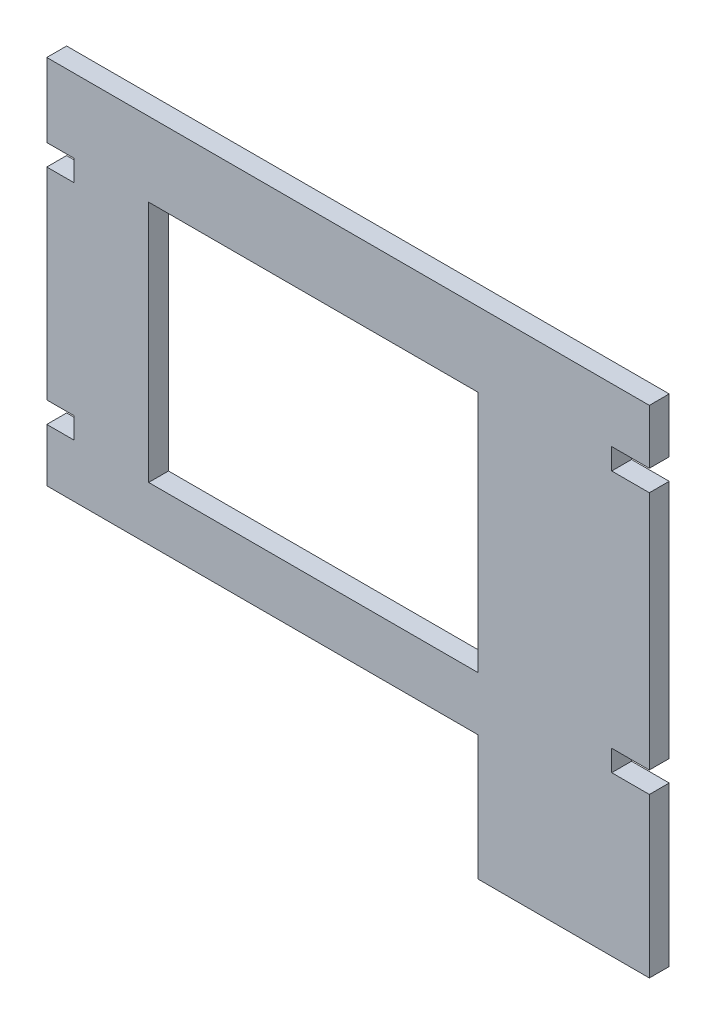
ISO-10303-21;
HEADER;
FILE_DESCRIPTION(('STEP AP214'),'2;1');
FILE_NAME('part.step','',(''),(''),'','','');
FILE_SCHEMA(('AUTOMOTIVE_DESIGN { 1 0 10303 214 1 1 1 1 }'));
ENDSEC;
DATA;
#1=APPLICATION_CONTEXT('core data for automotive mechanical design processes');
#2=APPLICATION_PROTOCOL_DEFINITION('international standard','automotive_design',2000,#1);
#3=PRODUCT_CONTEXT('',#1,'mechanical');
#4=PRODUCT('Part','Part','',(#3));
#5=PRODUCT_RELATED_PRODUCT_CATEGORY('part','',(#4));
#6=PRODUCT_DEFINITION_FORMATION('','',#4);
#7=PRODUCT_DEFINITION_CONTEXT('part definition',#1,'design');
#8=PRODUCT_DEFINITION('design','',#6,#7);
#9=PRODUCT_DEFINITION_SHAPE('','',#8);
#10=(LENGTH_UNIT() NAMED_UNIT(*) SI_UNIT(.MILLI.,.METRE.));
#11=(NAMED_UNIT(*) PLANE_ANGLE_UNIT() SI_UNIT($,.RADIAN.));
#12=(NAMED_UNIT(*) SI_UNIT($,.STERADIAN.) SOLID_ANGLE_UNIT());
#13=UNCERTAINTY_MEASURE_WITH_UNIT(LENGTH_MEASURE(1.E-05),#10,'distance_accuracy_value','');
#14=(GEOMETRIC_REPRESENTATION_CONTEXT(3) GLOBAL_UNCERTAINTY_ASSIGNED_CONTEXT((#13)) GLOBAL_UNIT_ASSIGNED_CONTEXT((#10,
#11,#12)) REPRESENTATION_CONTEXT('',''));
#15=CARTESIAN_POINT('',(0.,0.,0.));
#16=DIRECTION('',(0.,0.,1.));
#17=DIRECTION('',(1.,0.,0.));
#18=AXIS2_PLACEMENT_3D('',#15,#16,#17);
#19=CARTESIAN_POINT('',(81.3,0.,-19.8));
#20=DIRECTION('',(-1.,0.,0.));
#21=DIRECTION('',(0.,0.,1.));
#22=AXIS2_PLACEMENT_3D('',#19,#20,#21);
#23=PLANE('',#22);
#24=DIRECTION('',(0.,-1.,0.));
#25=VECTOR('',#24,1.);
#26=CARTESIAN_POINT('',(81.3,0.,-19.8));
#27=LINE('',#26,#25);
#28=CARTESIAN_POINT('',(81.3,21.5,-19.8));
#29=VERTEX_POINT('',#28);
#30=CARTESIAN_POINT('',(81.3,18.3,-19.8));
#31=VERTEX_POINT('',#30);
#32=EDGE_CURVE('E416',#29,#31,#27,.T.);
#33=ORIENTED_EDGE('',*,*,#32,.F.);
#34=DIRECTION('',(0.,0.,-1.));
#35=VECTOR('',#34,1.);
#36=CARTESIAN_POINT('',(81.3,21.5,24.14));
#37=LINE('',#36,#35);
#38=CARTESIAN_POINT('',(81.3,21.5,-16.8));
#39=VERTEX_POINT('',#38);
#40=EDGE_CURVE('E371',#39,#29,#37,.T.);
#41=ORIENTED_EDGE('',*,*,#40,.F.);
#42=DIRECTION('',(0.,-1.,0.));
#43=VECTOR('',#42,1.);
#44=CARTESIAN_POINT('',(81.3,0.,-16.8));
#45=LINE('',#44,#43);
#46=CARTESIAN_POINT('',(81.3,18.3,-16.8));
#47=VERTEX_POINT('',#46);
#48=EDGE_CURVE('E409',#39,#47,#45,.T.);
#49=ORIENTED_EDGE('',*,*,#48,.T.);
#50=DIRECTION('',(0.,0.,-1.));
#51=VECTOR('',#50,1.);
#52=CARTESIAN_POINT('',(81.3,18.3,24.14));
#53=LINE('',#52,#51);
#54=EDGE_CURVE('E370',#47,#31,#53,.T.);
#55=ORIENTED_EDGE('',*,*,#54,.T.);
#56=EDGE_LOOP('',(#33,#41,#49,#55));
#57=FACE_BOUND('',#56,.T.);
#58=ADVANCED_FACE('F32',(#57),#23,.F.);
#59=CARTESIAN_POINT('',(81.3,61.,-16.8));
#60=VERTEX_POINT('',#59);
#61=CARTESIAN_POINT('',(81.3,57.8,-16.8));
#62=VERTEX_POINT('',#61);
#63=EDGE_CURVE('E393',#60,#62,#45,.T.);
#64=ORIENTED_EDGE('',*,*,#63,.T.);
#65=DIRECTION('',(0.,0.,-1.));
#66=VECTOR('',#65,1.);
#67=CARTESIAN_POINT('',(81.3,57.8,24.14));
#68=LINE('',#67,#66);
#69=CARTESIAN_POINT('',(81.3,57.8,-19.8));
#70=VERTEX_POINT('',#69);
#71=EDGE_CURVE('E354',#62,#70,#68,.T.);
#72=ORIENTED_EDGE('',*,*,#71,.T.);
#73=CARTESIAN_POINT('',(81.3,61.,-19.8));
#74=VERTEX_POINT('',#73);
#75=EDGE_CURVE('E40',#74,#70,#27,.T.);
#76=ORIENTED_EDGE('',*,*,#75,.F.);
#77=DIRECTION('',(0.,0.,-1.));
#78=VECTOR('',#77,1.);
#79=CARTESIAN_POINT('',(81.3,61.,24.14));
#80=LINE('',#79,#78);
#81=EDGE_CURVE('E355',#60,#74,#80,.T.);
#82=ORIENTED_EDGE('',*,*,#81,.F.);
#83=EDGE_LOOP('',(#64,#72,#76,#82));
#84=FACE_BOUND('',#83,.T.);
#85=ADVANCED_FACE('F468',(#84),#23,.F.);
#86=CARTESIAN_POINT('',(0.,66.14,-19.8));
#87=DIRECTION('',(1.,0.,0.));
#88=DIRECTION('',(0.,1.,0.));
#89=AXIS2_PLACEMENT_3D('',#86,#87,#88);
#90=PLANE('',#89);
#91=DIRECTION('',(0.,1.,0.));
#92=VECTOR('',#91,1.);
#93=CARTESIAN_POINT('',(0.,66.14,-19.8));
#94=LINE('',#93,#92);
#95=CARTESIAN_POINT('',(0.,21.2,-19.8));
#96=VERTEX_POINT('',#95);
#97=CARTESIAN_POINT('',(0.,24.4,-19.8));
#98=VERTEX_POINT('',#97);
#99=EDGE_CURVE('E400',#96,#98,#94,.T.);
#100=ORIENTED_EDGE('',*,*,#99,.F.);
#101=DIRECTION('',(0.,0.,-1.));
#102=VECTOR('',#101,1.);
#103=CARTESIAN_POINT('',(0.,21.2,24.14));
#104=LINE('',#103,#102);
#105=CARTESIAN_POINT('',(0.,21.2,-16.8));
#106=VERTEX_POINT('',#105);
#107=EDGE_CURVE('E339',#106,#96,#104,.T.);
#108=ORIENTED_EDGE('',*,*,#107,.F.);
#109=DIRECTION('',(0.,1.,0.));
#110=VECTOR('',#109,1.);
#111=CARTESIAN_POINT('',(0.,66.14,-16.8));
#112=LINE('',#111,#110);
#113=CARTESIAN_POINT('',(0.,24.4,-16.8));
#114=VERTEX_POINT('',#113);
#115=EDGE_CURVE('E408',#106,#114,#112,.T.);
#116=ORIENTED_EDGE('',*,*,#115,.T.);
#117=DIRECTION('',(0.,0.,-1.));
#118=VECTOR('',#117,1.);
#119=CARTESIAN_POINT('',(0.,24.4,24.14));
#120=LINE('',#119,#118);
#121=EDGE_CURVE('E338',#114,#98,#120,.T.);
#122=ORIENTED_EDGE('',*,*,#121,.T.);
#123=EDGE_LOOP('',(#100,#108,#116,#122));
#124=FACE_BOUND('',#123,.T.);
#125=ADVANCED_FACE('F425',(#124),#90,.F.);
#126=CARTESIAN_POINT('',(0.,54.9,-19.8));
#127=VERTEX_POINT('',#126);
#128=CARTESIAN_POINT('',(0.,58.1,-19.8));
#129=VERTEX_POINT('',#128);
#130=EDGE_CURVE('E392',#127,#129,#94,.T.);
#131=ORIENTED_EDGE('',*,*,#130,.F.);
#132=DIRECTION('',(0.,0.,-1.));
#133=VECTOR('',#132,1.);
#134=CARTESIAN_POINT('',(0.,54.9,24.14));
#135=LINE('',#134,#133);
#136=CARTESIAN_POINT('',(0.,54.9,-16.8));
#137=VERTEX_POINT('',#136);
#138=EDGE_CURVE('E323',#137,#127,#135,.T.);
#139=ORIENTED_EDGE('',*,*,#138,.F.);
#140=CARTESIAN_POINT('',(0.,58.1,-16.8));
#141=VERTEX_POINT('',#140);
#142=EDGE_CURVE('E405',#137,#141,#112,.T.);
#143=ORIENTED_EDGE('',*,*,#142,.T.);
#144=DIRECTION('',(0.,0.,-1.));
#145=VECTOR('',#144,1.);
#146=CARTESIAN_POINT('',(0.,58.1,24.14));
#147=LINE('',#146,#145);
#148=EDGE_CURVE('E322',#141,#129,#147,.T.);
#149=ORIENTED_EDGE('',*,*,#148,.T.);
#150=EDGE_LOOP('',(#131,#139,#143,#149));
#151=FACE_BOUND('',#150,.T.);
#152=ADVANCED_FACE('F439',(#151),#90,.F.);
#153=CARTESIAN_POINT('',(0.,0.,-19.8));
#154=DIRECTION('',(0.,0.,1.));
#155=DIRECTION('',(1.,0.,0.));
#156=AXIS2_PLACEMENT_3D('',#153,#154,#155);
#157=PLANE('',#156);
#158=DIRECTION('',(0.,1.,0.));
#159=VECTOR('',#158,1.);
#160=CARTESIAN_POINT('',(61.06,-5.73160723649835,-19.8));
#161=LINE('',#160,#159);
#162=CARTESIAN_POINT('',(61.06,-5.73160723649835,-19.8));
#163=VERTEX_POINT('',#162);
#164=CARTESIAN_POINT('',(61.06,13.16,-19.8));
#165=VERTEX_POINT('',#164);
#166=EDGE_CURVE('E225',#163,#165,#161,.T.);
#167=ORIENTED_EDGE('',*,*,#166,.T.);
#168=DIRECTION('',(-1.,0.,0.));
#169=VECTOR('',#168,1.);
#170=CARTESIAN_POINT('',(61.56,13.16,-19.8));
#171=LINE('',#170,#169);
#172=CARTESIAN_POINT('',(-4.1,13.16,-19.8));
#173=VERTEX_POINT('',#172);
#174=EDGE_CURVE('E390',#165,#173,#171,.T.);
#175=ORIENTED_EDGE('',*,*,#174,.T.);
#176=DIRECTION('',(0.,-1.,0.));
#177=VECTOR('',#176,1.);
#178=CARTESIAN_POINT('',(-4.1,21.2,-19.8));
#179=LINE('',#178,#177);
#180=CARTESIAN_POINT('',(-4.1,21.2,-19.8));
#181=VERTEX_POINT('',#180);
#182=EDGE_CURVE('E262',#181,#173,#179,.T.);
#183=ORIENTED_EDGE('',*,*,#182,.F.);
#184=DIRECTION('',(-1.,0.,0.));
#185=VECTOR('',#184,1.);
#186=CARTESIAN_POINT('',(0.,21.2,-19.8));
#187=LINE('',#186,#185);
#188=EDGE_CURVE('E336',#96,#181,#187,.T.);
#189=ORIENTED_EDGE('',*,*,#188,.F.);
#190=ORIENTED_EDGE('',*,*,#99,.T.);
#191=DIRECTION('',(1.,0.,0.));
#192=VECTOR('',#191,1.);
#193=CARTESIAN_POINT('',(-4.,24.4,-19.8));
#194=LINE('',#193,#192);
#195=CARTESIAN_POINT('',(-4.1,24.4,-19.8));
#196=VERTEX_POINT('',#195);
#197=EDGE_CURVE('E333',#196,#98,#194,.T.);
#198=ORIENTED_EDGE('',*,*,#197,.F.);
#199=DIRECTION('',(0.,-1.,0.));
#200=VECTOR('',#199,1.);
#201=CARTESIAN_POINT('',(-4.1,54.9,-19.8));
#202=LINE('',#201,#200);
#203=CARTESIAN_POINT('',(-4.1,54.9,-19.8));
#204=VERTEX_POINT('',#203);
#205=EDGE_CURVE('E274',#204,#196,#202,.T.);
#206=ORIENTED_EDGE('',*,*,#205,.F.);
#207=DIRECTION('',(-1.,0.,0.));
#208=VECTOR('',#207,1.);
#209=CARTESIAN_POINT('',(0.,54.9,-19.8));
#210=LINE('',#209,#208);
#211=EDGE_CURVE('E320',#127,#204,#210,.T.);
#212=ORIENTED_EDGE('',*,*,#211,.F.);
#213=ORIENTED_EDGE('',*,*,#130,.T.);
#214=DIRECTION('',(1.,0.,0.));
#215=VECTOR('',#214,1.);
#216=CARTESIAN_POINT('',(-4.,58.1,-19.8));
#217=LINE('',#216,#215);
#218=CARTESIAN_POINT('',(-4.1,58.1,-19.8));
#219=VERTEX_POINT('',#218);
#220=EDGE_CURVE('E317',#219,#129,#217,.T.);
#221=ORIENTED_EDGE('',*,*,#220,.F.);
#222=DIRECTION('',(0.,-1.,0.));
#223=VECTOR('',#222,1.);
#224=CARTESIAN_POINT('',(-4.1,69.14,-19.8));
#225=LINE('',#224,#223);
#226=CARTESIAN_POINT('',(-4.1,69.24,-19.8));
#227=VERTEX_POINT('',#226);
#228=EDGE_CURVE('E277',#227,#219,#225,.T.);
#229=ORIENTED_EDGE('',*,*,#228,.F.);
#230=DIRECTION('',(-1.,0.,0.));
#231=VECTOR('',#230,1.);
#232=CARTESIAN_POINT('',(86.994661100132,69.24,-19.8));
#233=LINE('',#232,#231);
#234=CARTESIAN_POINT('',(86.994661100132,69.24,-19.8));
#235=VERTEX_POINT('',#234);
#236=EDGE_CURVE('E244',#235,#227,#233,.T.);
#237=ORIENTED_EDGE('',*,*,#236,.F.);
#238=DIRECTION('',(0.,1.,0.));
#239=VECTOR('',#238,1.);
#240=CARTESIAN_POINT('',(86.994661100132,61.,-19.8));
#241=LINE('',#240,#239);
#242=CARTESIAN_POINT('',(86.994661100132,61.,-19.8));
#243=VERTEX_POINT('',#242);
#244=EDGE_CURVE('E315',#243,#235,#241,.T.);
#245=ORIENTED_EDGE('',*,*,#244,.F.);
#246=DIRECTION('',(1.,0.,0.));
#247=VECTOR('',#246,1.);
#248=CARTESIAN_POINT('',(81.3,61.,-19.8));
#249=LINE('',#248,#247);
#250=EDGE_CURVE('E349',#74,#243,#249,.T.);
#251=ORIENTED_EDGE('',*,*,#250,.F.);
#252=ORIENTED_EDGE('',*,*,#75,.T.);
#253=DIRECTION('',(-1.,0.,0.));
#254=VECTOR('',#253,1.);
#255=CARTESIAN_POINT('',(86.894661100132,57.8,-19.8));
#256=LINE('',#255,#254);
#257=CARTESIAN_POINT('',(86.994661100132,57.8,-19.8));
#258=VERTEX_POINT('',#257);
#259=EDGE_CURVE('E351',#258,#70,#256,.T.);
#260=ORIENTED_EDGE('',*,*,#259,.F.);
#261=DIRECTION('',(0.,1.,0.));
#262=VECTOR('',#261,1.);
#263=CARTESIAN_POINT('',(86.994661100132,21.5,-19.8));
#264=LINE('',#263,#262);
#265=CARTESIAN_POINT('',(86.994661100132,21.5,-19.8));
#266=VERTEX_POINT('',#265);
#267=EDGE_CURVE('E306',#266,#258,#264,.T.);
#268=ORIENTED_EDGE('',*,*,#267,.F.);
#269=DIRECTION('',(1.,0.,0.));
#270=VECTOR('',#269,1.);
#271=CARTESIAN_POINT('',(81.3,21.5,-19.8));
#272=LINE('',#271,#270);
#273=EDGE_CURVE('E365',#29,#266,#272,.T.);
#274=ORIENTED_EDGE('',*,*,#273,.F.);
#275=ORIENTED_EDGE('',*,*,#32,.T.);
#276=DIRECTION('',(-1.,0.,0.));
#277=VECTOR('',#276,1.);
#278=CARTESIAN_POINT('',(86.894661100132,18.3,-19.8));
#279=LINE('',#278,#277);
#280=CARTESIAN_POINT('',(86.994661100132,18.3,-19.8));
#281=VERTEX_POINT('',#280);
#282=EDGE_CURVE('E367',#281,#31,#279,.T.);
#283=ORIENTED_EDGE('',*,*,#282,.F.);
#284=DIRECTION('',(0.,1.,0.));
#285=VECTOR('',#284,1.);
#286=CARTESIAN_POINT('',(86.994661100132,-5.73160723649835,-19.8));
#287=LINE('',#286,#285);
#288=CARTESIAN_POINT('',(86.994661100132,-5.73160723649835,-19.8));
#289=VERTEX_POINT('',#288);
#290=EDGE_CURVE('E288',#289,#281,#287,.T.);
#291=ORIENTED_EDGE('',*,*,#290,.F.);
#292=DIRECTION('',(1.,0.,0.));
#293=VECTOR('',#292,1.);
#294=CARTESIAN_POINT('',(61.56,-5.73160723649835,-19.8));
#295=LINE('',#294,#293);
#296=EDGE_CURVE('E383',#163,#289,#295,.T.);
#297=ORIENTED_EDGE('',*,*,#296,.F.);
#298=EDGE_LOOP('',(#167,#175,#183,#189,#190,#198,#206,#212,#213,#221,#229,#237,#245,#251,#252,
#260,#268,#274,#275,#283,#291,#297));
#299=FACE_BOUND('',#298,.T.);
#300=DIRECTION('',(1.,0.,0.));
#301=VECTOR('',#300,1.);
#302=CARTESIAN_POINT('',(11.8,58.,-19.8));
#303=LINE('',#302,#301);
#304=CARTESIAN_POINT('',(11.3,58.,-19.8));
#305=VERTEX_POINT('',#304);
#306=CARTESIAN_POINT('',(61.06,58.,-19.8));
#307=VERTEX_POINT('',#306);
#308=EDGE_CURVE('E208',#305,#307,#303,.T.);
#309=ORIENTED_EDGE('',*,*,#308,.F.);
#310=DIRECTION('',(0.,1.,0.));
#311=VECTOR('',#310,1.);
#312=CARTESIAN_POINT('',(11.3,58.,-19.8));
#313=LINE('',#312,#311);
#314=CARTESIAN_POINT('',(11.3,21.3,-19.8));
#315=VERTEX_POINT('',#314);
#316=EDGE_CURVE('E215',#315,#305,#313,.T.);
#317=ORIENTED_EDGE('',*,*,#316,.F.);
#318=DIRECTION('',(-1.,0.,0.));
#319=VECTOR('',#318,1.);
#320=CARTESIAN_POINT('',(61.56,21.3,-19.8));
#321=LINE('',#320,#319);
#322=CARTESIAN_POINT('',(61.06,21.3,-19.8));
#323=VERTEX_POINT('',#322);
#324=EDGE_CURVE('E200',#323,#315,#321,.T.);
#325=ORIENTED_EDGE('',*,*,#324,.F.);
#326=EDGE_CURVE('E223',#323,#307,#161,.T.);
#327=ORIENTED_EDGE('',*,*,#326,.T.);
#328=EDGE_LOOP('',(#309,#317,#325,#327));
#329=FACE_BOUND('',#328,.T.);
#330=ADVANCED_FACE('F219',(#299,#329),#157,.F.);
#331=CARTESIAN_POINT('',(0.,0.,-16.8));
#332=DIRECTION('',(0.,0.,1.));
#333=DIRECTION('',(1.,0.,0.));
#334=AXIS2_PLACEMENT_3D('',#331,#332,#333);
#335=PLANE('',#334);
#336=DIRECTION('',(0.,-1.,0.));
#337=VECTOR('',#336,1.);
#338=CARTESIAN_POINT('',(11.3,0.,-16.8));
#339=LINE('',#338,#337);
#340=CARTESIAN_POINT('',(11.3,58.,-16.8));
#341=VERTEX_POINT('',#340);
#342=CARTESIAN_POINT('',(11.3,21.3,-16.8));
#343=VERTEX_POINT('',#342);
#344=EDGE_CURVE('E11',#341,#343,#339,.T.);
#345=ORIENTED_EDGE('',*,*,#344,.F.);
#346=DIRECTION('',(1.,0.,0.));
#347=VECTOR('',#346,1.);
#348=CARTESIAN_POINT('',(11.8,58.,-16.8));
#349=LINE('',#348,#347);
#350=CARTESIAN_POINT('',(61.06,58.,-16.8));
#351=VERTEX_POINT('',#350);
#352=EDGE_CURVE('E209',#341,#351,#349,.T.);
#353=ORIENTED_EDGE('',*,*,#352,.T.);
#354=DIRECTION('',(0.,1.,0.));
#355=VECTOR('',#354,1.);
#356=CARTESIAN_POINT('',(61.06,-5.73160723649835,-16.8));
#357=LINE('',#356,#355);
#358=CARTESIAN_POINT('',(61.06,21.3,-16.8));
#359=VERTEX_POINT('',#358);
#360=EDGE_CURVE('E232',#359,#351,#357,.T.);
#361=ORIENTED_EDGE('',*,*,#360,.F.);
#362=DIRECTION('',(-1.,0.,0.));
#363=VECTOR('',#362,1.);
#364=CARTESIAN_POINT('',(61.56,21.3,-16.8));
#365=LINE('',#364,#363);
#366=EDGE_CURVE('E52',#359,#343,#365,.T.);
#367=ORIENTED_EDGE('',*,*,#366,.T.);
#368=EDGE_LOOP('',(#345,#353,#361,#367));
#369=FACE_BOUND('',#368,.T.);
#370=DIRECTION('',(-1.,0.,0.));
#371=VECTOR('',#370,1.);
#372=CARTESIAN_POINT('',(61.56,13.16,-16.8));
#373=LINE('',#372,#371);
#374=CARTESIAN_POINT('',(61.06,13.16,-16.8));
#375=VERTEX_POINT('',#374);
#376=CARTESIAN_POINT('',(-4.1,13.16,-16.8));
#377=VERTEX_POINT('',#376);
#378=EDGE_CURVE('E386',#375,#377,#373,.T.);
#379=ORIENTED_EDGE('',*,*,#378,.F.);
#380=CARTESIAN_POINT('',(61.06,-5.73160723649835,-16.8));
#381=VERTEX_POINT('',#380);
#382=EDGE_CURVE('E229',#381,#375,#357,.T.);
#383=ORIENTED_EDGE('',*,*,#382,.F.);
#384=DIRECTION('',(-1.,0.,0.));
#385=VECTOR('',#384,1.);
#386=CARTESIAN_POINT('',(86.894661100132,-5.73160723649835,-16.8));
#387=LINE('',#386,#385);
#388=CARTESIAN_POINT('',(86.994661100132,-5.73160723649835,-16.8));
#389=VERTEX_POINT('',#388);
#390=EDGE_CURVE('E381',#389,#381,#387,.T.);
#391=ORIENTED_EDGE('',*,*,#390,.F.);
#392=DIRECTION('',(0.,-1.,0.));
#393=VECTOR('',#392,1.);
#394=CARTESIAN_POINT('',(86.994661100132,18.3,-16.8));
#395=LINE('',#394,#393);
#396=CARTESIAN_POINT('',(86.994661100132,18.3,-16.8));
#397=VERTEX_POINT('',#396);
#398=EDGE_CURVE('E294',#397,#389,#395,.T.);
#399=ORIENTED_EDGE('',*,*,#398,.F.);
#400=DIRECTION('',(1.,0.,0.));
#401=VECTOR('',#400,1.);
#402=CARTESIAN_POINT('',(0.,18.3,-16.8));
#403=LINE('',#402,#401);
#404=EDGE_CURVE('E379',#47,#397,#403,.T.);
#405=ORIENTED_EDGE('',*,*,#404,.F.);
#406=ORIENTED_EDGE('',*,*,#48,.F.);
#407=DIRECTION('',(-1.,0.,0.));
#408=VECTOR('',#407,1.);
#409=CARTESIAN_POINT('',(0.,21.5,-16.8));
#410=LINE('',#409,#408);
#411=CARTESIAN_POINT('',(86.994661100132,21.5,-16.8));
#412=VERTEX_POINT('',#411);
#413=EDGE_CURVE('E374',#412,#39,#410,.T.);
#414=ORIENTED_EDGE('',*,*,#413,.F.);
#415=DIRECTION('',(0.,-1.,0.));
#416=VECTOR('',#415,1.);
#417=CARTESIAN_POINT('',(86.994661100132,57.8,-16.8));
#418=LINE('',#417,#416);
#419=CARTESIAN_POINT('',(86.994661100132,57.8,-16.8));
#420=VERTEX_POINT('',#419);
#421=EDGE_CURVE('E300',#420,#412,#418,.T.);
#422=ORIENTED_EDGE('',*,*,#421,.F.);
#423=DIRECTION('',(1.,0.,0.));
#424=VECTOR('',#423,1.);
#425=CARTESIAN_POINT('',(0.,57.8,-16.8));
#426=LINE('',#425,#424);
#427=EDGE_CURVE('E358',#62,#420,#426,.T.);
#428=ORIENTED_EDGE('',*,*,#427,.F.);
#429=ORIENTED_EDGE('',*,*,#63,.F.);
#430=DIRECTION('',(-1.,0.,0.));
#431=VECTOR('',#430,1.);
#432=CARTESIAN_POINT('',(0.,61.,-16.8));
#433=LINE('',#432,#431);
#434=CARTESIAN_POINT('',(86.994661100132,61.,-16.8));
#435=VERTEX_POINT('',#434);
#436=EDGE_CURVE('E362',#435,#60,#433,.T.);
#437=ORIENTED_EDGE('',*,*,#436,.F.);
#438=DIRECTION('',(0.,-1.,0.));
#439=VECTOR('',#438,1.);
#440=CARTESIAN_POINT('',(86.994661100132,69.14,-16.8));
#441=LINE('',#440,#439);
#442=CARTESIAN_POINT('',(86.994661100132,69.24,-16.8));
#443=VERTEX_POINT('',#442);
#444=EDGE_CURVE('E309',#443,#435,#441,.T.);
#445=ORIENTED_EDGE('',*,*,#444,.F.);
#446=DIRECTION('',(1.,0.,0.));
#447=VECTOR('',#446,1.);
#448=CARTESIAN_POINT('',(-4.1,69.24,-16.8));
#449=LINE('',#448,#447);
#450=CARTESIAN_POINT('',(-4.1,69.24,-16.8));
#451=VERTEX_POINT('',#450);
#452=EDGE_CURVE('E250',#451,#443,#449,.T.);
#453=ORIENTED_EDGE('',*,*,#452,.F.);
#454=DIRECTION('',(0.,1.,0.));
#455=VECTOR('',#454,1.);
#456=CARTESIAN_POINT('',(-4.1,58.1,-16.8));
#457=LINE('',#456,#455);
#458=CARTESIAN_POINT('',(-4.1,58.1,-16.8));
#459=VERTEX_POINT('',#458);
#460=EDGE_CURVE('E283',#459,#451,#457,.T.);
#461=ORIENTED_EDGE('',*,*,#460,.F.);
#462=DIRECTION('',(-1.,0.,0.));
#463=VECTOR('',#462,1.);
#464=CARTESIAN_POINT('',(0.,58.1,-16.8));
#465=LINE('',#464,#463);
#466=EDGE_CURVE('E331',#141,#459,#465,.T.);
#467=ORIENTED_EDGE('',*,*,#466,.F.);
#468=ORIENTED_EDGE('',*,*,#142,.F.);
#469=DIRECTION('',(1.,0.,0.));
#470=VECTOR('',#469,1.);
#471=CARTESIAN_POINT('',(0.,54.9,-16.8));
#472=LINE('',#471,#470);
#473=CARTESIAN_POINT('',(-4.1,54.9,-16.8));
#474=VERTEX_POINT('',#473);
#475=EDGE_CURVE('E326',#474,#137,#472,.T.);
#476=ORIENTED_EDGE('',*,*,#475,.F.);
#477=DIRECTION('',(0.,1.,0.));
#478=VECTOR('',#477,1.);
#479=CARTESIAN_POINT('',(-4.1,24.4,-16.8));
#480=LINE('',#479,#478);
#481=CARTESIAN_POINT('',(-4.1,24.4,-16.8));
#482=VERTEX_POINT('',#481);
#483=EDGE_CURVE('E268',#482,#474,#480,.T.);
#484=ORIENTED_EDGE('',*,*,#483,.F.);
#485=DIRECTION('',(-1.,0.,0.));
#486=VECTOR('',#485,1.);
#487=CARTESIAN_POINT('',(0.,24.4,-16.8));
#488=LINE('',#487,#486);
#489=EDGE_CURVE('E347',#114,#482,#488,.T.);
#490=ORIENTED_EDGE('',*,*,#489,.F.);
#491=ORIENTED_EDGE('',*,*,#115,.F.);
#492=DIRECTION('',(1.,0.,0.));
#493=VECTOR('',#492,1.);
#494=CARTESIAN_POINT('',(0.,21.2,-16.8));
#495=LINE('',#494,#493);
#496=CARTESIAN_POINT('',(-4.1,21.2,-16.8));
#497=VERTEX_POINT('',#496);
#498=EDGE_CURVE('E342',#497,#106,#495,.T.);
#499=ORIENTED_EDGE('',*,*,#498,.F.);
#500=DIRECTION('',(0.,1.,0.));
#501=VECTOR('',#500,1.);
#502=CARTESIAN_POINT('',(-4.1,13.16,-16.8));
#503=LINE('',#502,#501);
#504=EDGE_CURVE('E256',#377,#497,#503,.T.);
#505=ORIENTED_EDGE('',*,*,#504,.F.);
#506=EDGE_LOOP('',(#379,#383,#391,#399,#405,#406,#414,#422,#428,#429,#437,#445,#453,#461,#467,
#468,#476,#484,#490,#491,#499,#505));
#507=FACE_BOUND('',#506,.T.);
#508=ADVANCED_FACE('F456',(#369,#507),#335,.T.);
#509=CARTESIAN_POINT('',(61.56,13.16,-19.8));
#510=DIRECTION('',(0.,1.,0.));
#511=DIRECTION('',(-1.,0.,0.));
#512=AXIS2_PLACEMENT_3D('',#509,#510,#511);
#513=PLANE('',#512);
#514=ORIENTED_EDGE('',*,*,#174,.F.);
#515=DIRECTION('',(0.,0.,1.));
#516=VECTOR('',#515,1.);
#517=CARTESIAN_POINT('',(61.06,13.16,-19.8));
#518=LINE('',#517,#516);
#519=EDGE_CURVE('E238',#165,#375,#518,.T.);
#520=ORIENTED_EDGE('',*,*,#519,.T.);
#521=ORIENTED_EDGE('',*,*,#378,.T.);
#522=DIRECTION('',(0.,0.,1.));
#523=VECTOR('',#522,1.);
#524=CARTESIAN_POINT('',(-4.1,13.16,-19.8));
#525=LINE('',#524,#523);
#526=EDGE_CURVE('E253',#173,#377,#525,.T.);
#527=ORIENTED_EDGE('',*,*,#526,.F.);
#528=EDGE_LOOP('',(#514,#520,#521,#527));
#529=FACE_BOUND('',#528,.T.);
#530=ADVANCED_FACE('F34',(#529),#513,.F.);
#531=CARTESIAN_POINT('',(61.56,21.3,-19.8));
#532=DIRECTION('',(0.,1.,0.));
#533=DIRECTION('',(-1.,0.,0.));
#534=AXIS2_PLACEMENT_3D('',#531,#532,#533);
#535=PLANE('',#534);
#536=DIRECTION('',(0.,0.,1.));
#537=VECTOR('',#536,1.);
#538=CARTESIAN_POINT('',(61.06,21.3,-19.8));
#539=LINE('',#538,#537);
#540=EDGE_CURVE('E47',#323,#359,#539,.T.);
#541=ORIENTED_EDGE('',*,*,#540,.F.);
#542=ORIENTED_EDGE('',*,*,#324,.T.);
#543=DIRECTION('',(0.,0.,-1.));
#544=VECTOR('',#543,1.);
#545=CARTESIAN_POINT('',(11.3,21.3,30.34));
#546=LINE('',#545,#544);
#547=EDGE_CURVE('E203',#343,#315,#546,.T.);
#548=ORIENTED_EDGE('',*,*,#547,.F.);
#549=ORIENTED_EDGE('',*,*,#366,.F.);
#550=EDGE_LOOP('',(#541,#542,#548,#549));
#551=FACE_BOUND('',#550,.T.);
#552=ADVANCED_FACE('F202',(#551),#535,.T.);
#553=CARTESIAN_POINT('',(11.8,58.,-19.8));
#554=DIRECTION('',(0.,-1.,0.));
#555=DIRECTION('',(1.,0.,0.));
#556=AXIS2_PLACEMENT_3D('',#553,#554,#555);
#557=PLANE('',#556);
#558=DIRECTION('',(0.,0.,-1.));
#559=VECTOR('',#558,1.);
#560=CARTESIAN_POINT('',(61.06,58.,46.9335685565094));
#561=LINE('',#560,#559);
#562=EDGE_CURVE('E231',#351,#307,#561,.T.);
#563=ORIENTED_EDGE('',*,*,#562,.F.);
#564=ORIENTED_EDGE('',*,*,#352,.F.);
#565=DIRECTION('',(0.,0.,-1.));
#566=VECTOR('',#565,1.);
#567=CARTESIAN_POINT('',(11.3,58.,30.34));
#568=LINE('',#567,#566);
#569=EDGE_CURVE('E217',#341,#305,#568,.T.);
#570=ORIENTED_EDGE('',*,*,#569,.T.);
#571=ORIENTED_EDGE('',*,*,#308,.T.);
#572=EDGE_LOOP('',(#563,#564,#570,#571));
#573=FACE_BOUND('',#572,.T.);
#574=ADVANCED_FACE('F538',(#573),#557,.T.);
#575=CARTESIAN_POINT('',(0.,-5.73160723649835,0.));
#576=DIRECTION('',(0.,-1.,0.));
#577=DIRECTION('',(0.,0.,-1.));
#578=AXIS2_PLACEMENT_3D('',#575,#576,#577);
#579=PLANE('',#578);
#580=ORIENTED_EDGE('',*,*,#296,.T.);
#581=DIRECTION('',(0.,0.,-1.));
#582=VECTOR('',#581,1.);
#583=CARTESIAN_POINT('',(86.994661100132,-5.73160723649835,-16.8));
#584=LINE('',#583,#582);
#585=EDGE_CURVE('E285',#389,#289,#584,.T.);
#586=ORIENTED_EDGE('',*,*,#585,.F.);
#587=ORIENTED_EDGE('',*,*,#390,.T.);
#588=DIRECTION('',(0.,0.,-1.));
#589=VECTOR('',#588,1.);
#590=CARTESIAN_POINT('',(61.06,-5.73160723649835,46.9335685565094));
#591=LINE('',#590,#589);
#592=EDGE_CURVE('E228',#381,#163,#591,.T.);
#593=ORIENTED_EDGE('',*,*,#592,.T.);
#594=EDGE_LOOP('',(#580,#586,#587,#593));
#595=FACE_BOUND('',#594,.T.);
#596=ADVANCED_FACE('F492',(#595),#579,.T.);
#597=CARTESIAN_POINT('',(81.3,21.5,24.14));
#598=DIRECTION('',(0.,1.,0.));
#599=DIRECTION('',(0.,0.,1.));
#600=AXIS2_PLACEMENT_3D('',#597,#598,#599);
#601=PLANE('',#600);
#602=ORIENTED_EDGE('',*,*,#413,.T.);
#603=ORIENTED_EDGE('',*,*,#40,.T.);
#604=ORIENTED_EDGE('',*,*,#273,.T.);
#605=DIRECTION('',(0.,0.,-1.));
#606=VECTOR('',#605,1.);
#607=CARTESIAN_POINT('',(86.994661100132,21.5,-16.8));
#608=LINE('',#607,#606);
#609=EDGE_CURVE('E303',#412,#266,#608,.T.);
#610=ORIENTED_EDGE('',*,*,#609,.F.);
#611=EDGE_LOOP('',(#602,#603,#604,#610));
#612=FACE_BOUND('',#611,.T.);
#613=ADVANCED_FACE('F478',(#612),#601,.F.);
#614=CARTESIAN_POINT('',(86.894661100132,18.3,24.14));
#615=DIRECTION('',(0.,-1.,0.));
#616=DIRECTION('',(0.,0.,-1.));
#617=AXIS2_PLACEMENT_3D('',#614,#615,#616);
#618=PLANE('',#617);
#619=ORIENTED_EDGE('',*,*,#404,.T.);
#620=DIRECTION('',(0.,0.,1.));
#621=VECTOR('',#620,1.);
#622=CARTESIAN_POINT('',(86.994661100132,18.3,-19.8));
#623=LINE('',#622,#621);
#624=EDGE_CURVE('E291',#281,#397,#623,.T.);
#625=ORIENTED_EDGE('',*,*,#624,.F.);
#626=ORIENTED_EDGE('',*,*,#282,.T.);
#627=ORIENTED_EDGE('',*,*,#54,.F.);
#628=EDGE_LOOP('',(#619,#625,#626,#627));
#629=FACE_BOUND('',#628,.T.);
#630=ADVANCED_FACE('F485',(#629),#618,.F.);
#631=CARTESIAN_POINT('',(86.894661100132,57.8,24.14));
#632=DIRECTION('',(0.,-1.,0.));
#633=DIRECTION('',(0.,0.,-1.));
#634=AXIS2_PLACEMENT_3D('',#631,#632,#633);
#635=PLANE('',#634);
#636=ORIENTED_EDGE('',*,*,#427,.T.);
#637=DIRECTION('',(0.,0.,1.));
#638=VECTOR('',#637,1.);
#639=CARTESIAN_POINT('',(86.994661100132,57.8,-19.8));
#640=LINE('',#639,#638);
#641=EDGE_CURVE('E297',#258,#420,#640,.T.);
#642=ORIENTED_EDGE('',*,*,#641,.F.);
#643=ORIENTED_EDGE('',*,*,#259,.T.);
#644=ORIENTED_EDGE('',*,*,#71,.F.);
#645=EDGE_LOOP('',(#636,#642,#643,#644));
#646=FACE_BOUND('',#645,.T.);
#647=ADVANCED_FACE('F472',(#646),#635,.F.);
#648=CARTESIAN_POINT('',(81.3,61.,24.14));
#649=DIRECTION('',(0.,1.,0.));
#650=DIRECTION('',(0.,0.,1.));
#651=AXIS2_PLACEMENT_3D('',#648,#649,#650);
#652=PLANE('',#651);
#653=ORIENTED_EDGE('',*,*,#436,.T.);
#654=ORIENTED_EDGE('',*,*,#81,.T.);
#655=ORIENTED_EDGE('',*,*,#250,.T.);
#656=DIRECTION('',(0.,0.,-1.));
#657=VECTOR('',#656,1.);
#658=CARTESIAN_POINT('',(86.994661100132,61.,-16.8));
#659=LINE('',#658,#657);
#660=EDGE_CURVE('E312',#435,#243,#659,.T.);
#661=ORIENTED_EDGE('',*,*,#660,.F.);
#662=EDGE_LOOP('',(#653,#654,#655,#661));
#663=FACE_BOUND('',#662,.T.);
#664=ADVANCED_FACE('F462',(#663),#652,.F.);
#665=CARTESIAN_POINT('',(0.,21.2,24.14));
#666=DIRECTION('',(0.,-1.,0.));
#667=DIRECTION('',(1.,0.,0.));
#668=AXIS2_PLACEMENT_3D('',#665,#666,#667);
#669=PLANE('',#668);
#670=ORIENTED_EDGE('',*,*,#498,.T.);
#671=ORIENTED_EDGE('',*,*,#107,.T.);
#672=ORIENTED_EDGE('',*,*,#188,.T.);
#673=DIRECTION('',(0.,0.,-1.));
#674=VECTOR('',#673,1.);
#675=CARTESIAN_POINT('',(-4.1,21.2,-16.8));
#676=LINE('',#675,#674);
#677=EDGE_CURVE('E259',#497,#181,#676,.T.);
#678=ORIENTED_EDGE('',*,*,#677,.F.);
#679=EDGE_LOOP('',(#670,#671,#672,#678));
#680=FACE_BOUND('',#679,.T.);
#681=ADVANCED_FACE('F505',(#680),#669,.F.);
#682=CARTESIAN_POINT('',(-4.,24.4,24.14));
#683=DIRECTION('',(0.,1.,0.));
#684=DIRECTION('',(-1.,0.,0.));
#685=AXIS2_PLACEMENT_3D('',#682,#683,#684);
#686=PLANE('',#685);
#687=ORIENTED_EDGE('',*,*,#489,.T.);
#688=DIRECTION('',(0.,0.,1.));
#689=VECTOR('',#688,1.);
#690=CARTESIAN_POINT('',(-4.1,24.4,-19.8));
#691=LINE('',#690,#689);
#692=EDGE_CURVE('E265',#196,#482,#691,.T.);
#693=ORIENTED_EDGE('',*,*,#692,.F.);
#694=ORIENTED_EDGE('',*,*,#197,.T.);
#695=ORIENTED_EDGE('',*,*,#121,.F.);
#696=EDGE_LOOP('',(#687,#693,#694,#695));
#697=FACE_BOUND('',#696,.T.);
#698=ADVANCED_FACE('F429',(#697),#686,.F.);
#699=CARTESIAN_POINT('',(0.,54.9,24.14));
#700=DIRECTION('',(0.,-1.,0.));
#701=DIRECTION('',(1.,0.,0.));
#702=AXIS2_PLACEMENT_3D('',#699,#700,#701);
#703=PLANE('',#702);
#704=ORIENTED_EDGE('',*,*,#475,.T.);
#705=ORIENTED_EDGE('',*,*,#138,.T.);
#706=ORIENTED_EDGE('',*,*,#211,.T.);
#707=DIRECTION('',(0.,0.,-1.));
#708=VECTOR('',#707,1.);
#709=CARTESIAN_POINT('',(-4.1,54.9,-16.8));
#710=LINE('',#709,#708);
#711=EDGE_CURVE('E271',#474,#204,#710,.T.);
#712=ORIENTED_EDGE('',*,*,#711,.F.);
#713=EDGE_LOOP('',(#704,#705,#706,#712));
#714=FACE_BOUND('',#713,.T.);
#715=ADVANCED_FACE('F436',(#714),#703,.F.);
#716=CARTESIAN_POINT('',(-4.,58.1,24.14));
#717=DIRECTION('',(0.,1.,0.));
#718=DIRECTION('',(0.,0.,1.));
#719=AXIS2_PLACEMENT_3D('',#716,#717,#718);
#720=PLANE('',#719);
#721=ORIENTED_EDGE('',*,*,#466,.T.);
#722=DIRECTION('',(0.,0.,1.));
#723=VECTOR('',#722,1.);
#724=CARTESIAN_POINT('',(-4.1,58.1,-19.8));
#725=LINE('',#724,#723);
#726=EDGE_CURVE('E280',#219,#459,#725,.T.);
#727=ORIENTED_EDGE('',*,*,#726,.F.);
#728=ORIENTED_EDGE('',*,*,#220,.T.);
#729=ORIENTED_EDGE('',*,*,#148,.F.);
#730=EDGE_LOOP('',(#721,#727,#728,#729));
#731=FACE_BOUND('',#730,.T.);
#732=ADVANCED_FACE('F444',(#731),#720,.F.);
#733=CARTESIAN_POINT('',(86.994661100132,0.,0.));
#734=DIRECTION('',(1.,0.,0.));
#735=DIRECTION('',(0.,0.,-1.));
#736=AXIS2_PLACEMENT_3D('',#733,#734,#735);
#737=PLANE('',#736);
#738=ORIENTED_EDGE('',*,*,#244,.T.);
#739=DIRECTION('',(0.,0.,-1.));
#740=VECTOR('',#739,1.);
#741=CARTESIAN_POINT('',(86.994661100132,69.24,-16.8));
#742=LINE('',#741,#740);
#743=EDGE_CURVE('E241',#443,#235,#742,.T.);
#744=ORIENTED_EDGE('',*,*,#743,.F.);
#745=ORIENTED_EDGE('',*,*,#444,.T.);
#746=ORIENTED_EDGE('',*,*,#660,.T.);
#747=EDGE_LOOP('',(#738,#744,#745,#746));
#748=FACE_BOUND('',#747,.T.);
#749=ADVANCED_FACE('F459',(#748),#737,.T.);
#750=CARTESIAN_POINT('',(86.994661100132,0.,0.));
#751=DIRECTION('',(1.,0.,0.));
#752=DIRECTION('',(0.,0.,-1.));
#753=AXIS2_PLACEMENT_3D('',#750,#751,#752);
#754=PLANE('',#753);
#755=ORIENTED_EDGE('',*,*,#641,.T.);
#756=ORIENTED_EDGE('',*,*,#421,.T.);
#757=ORIENTED_EDGE('',*,*,#609,.T.);
#758=ORIENTED_EDGE('',*,*,#267,.T.);
#759=EDGE_LOOP('',(#755,#756,#757,#758));
#760=FACE_BOUND('',#759,.T.);
#761=ADVANCED_FACE('F475',(#760),#754,.T.);
#762=CARTESIAN_POINT('',(86.994661100132,0.,0.));
#763=DIRECTION('',(1.,0.,0.));
#764=DIRECTION('',(0.,0.,-1.));
#765=AXIS2_PLACEMENT_3D('',#762,#763,#764);
#766=PLANE('',#765);
#767=ORIENTED_EDGE('',*,*,#585,.T.);
#768=ORIENTED_EDGE('',*,*,#290,.T.);
#769=ORIENTED_EDGE('',*,*,#624,.T.);
#770=ORIENTED_EDGE('',*,*,#398,.T.);
#771=EDGE_LOOP('',(#767,#768,#769,#770));
#772=FACE_BOUND('',#771,.T.);
#773=ADVANCED_FACE('F488',(#772),#766,.T.);
#774=CARTESIAN_POINT('',(-4.1,0.,0.));
#775=DIRECTION('',(-1.,0.,0.));
#776=DIRECTION('',(0.,0.,1.));
#777=AXIS2_PLACEMENT_3D('',#774,#775,#776);
#778=PLANE('',#777);
#779=ORIENTED_EDGE('',*,*,#460,.T.);
#780=DIRECTION('',(0.,0.,1.));
#781=VECTOR('',#780,1.);
#782=CARTESIAN_POINT('',(-4.1,69.24,-19.8));
#783=LINE('',#782,#781);
#784=EDGE_CURVE('E247',#227,#451,#783,.T.);
#785=ORIENTED_EDGE('',*,*,#784,.F.);
#786=ORIENTED_EDGE('',*,*,#228,.T.);
#787=ORIENTED_EDGE('',*,*,#726,.T.);
#788=EDGE_LOOP('',(#779,#785,#786,#787));
#789=FACE_BOUND('',#788,.T.);
#790=ADVANCED_FACE('F448',(#789),#778,.T.);
#791=CARTESIAN_POINT('',(-4.1,0.,0.));
#792=DIRECTION('',(-1.,0.,0.));
#793=DIRECTION('',(0.,0.,1.));
#794=AXIS2_PLACEMENT_3D('',#791,#792,#793);
#795=PLANE('',#794);
#796=ORIENTED_EDGE('',*,*,#692,.T.);
#797=ORIENTED_EDGE('',*,*,#483,.T.);
#798=ORIENTED_EDGE('',*,*,#711,.T.);
#799=ORIENTED_EDGE('',*,*,#205,.T.);
#800=EDGE_LOOP('',(#796,#797,#798,#799));
#801=FACE_BOUND('',#800,.T.);
#802=ADVANCED_FACE('F432',(#801),#795,.T.);
#803=CARTESIAN_POINT('',(-4.1,0.,0.));
#804=DIRECTION('',(-1.,0.,0.));
#805=DIRECTION('',(0.,0.,1.));
#806=AXIS2_PLACEMENT_3D('',#803,#804,#805);
#807=PLANE('',#806);
#808=ORIENTED_EDGE('',*,*,#526,.T.);
#809=ORIENTED_EDGE('',*,*,#504,.T.);
#810=ORIENTED_EDGE('',*,*,#677,.T.);
#811=ORIENTED_EDGE('',*,*,#182,.T.);
#812=EDGE_LOOP('',(#808,#809,#810,#811));
#813=FACE_BOUND('',#812,.T.);
#814=ADVANCED_FACE('F502',(#813),#807,.T.);
#815=CARTESIAN_POINT('',(0.,69.24,0.));
#816=DIRECTION('',(0.,1.,0.));
#817=DIRECTION('',(0.,0.,1.));
#818=AXIS2_PLACEMENT_3D('',#815,#816,#817);
#819=PLANE('',#818);
#820=ORIENTED_EDGE('',*,*,#743,.T.);
#821=ORIENTED_EDGE('',*,*,#236,.T.);
#822=ORIENTED_EDGE('',*,*,#784,.T.);
#823=ORIENTED_EDGE('',*,*,#452,.T.);
#824=EDGE_LOOP('',(#820,#821,#822,#823));
#825=FACE_BOUND('',#824,.T.);
#826=ADVANCED_FACE('F452',(#825),#819,.T.);
#827=CARTESIAN_POINT('',(61.06,-5.73160723649835,46.9335685565094));
#828=DIRECTION('',(-1.,0.,0.));
#829=DIRECTION('',(0.,-1.,0.));
#830=AXIS2_PLACEMENT_3D('',#827,#828,#829);
#831=PLANE('',#830);
#832=ORIENTED_EDGE('',*,*,#519,.F.);
#833=ORIENTED_EDGE('',*,*,#166,.F.);
#834=ORIENTED_EDGE('',*,*,#592,.F.);
#835=ORIENTED_EDGE('',*,*,#382,.T.);
#836=EDGE_LOOP('',(#832,#833,#834,#835));
#837=FACE_BOUND('',#836,.T.);
#838=ADVANCED_FACE('F506',(#837),#831,.T.);
#839=ORIENTED_EDGE('',*,*,#326,.F.);
#840=ORIENTED_EDGE('',*,*,#540,.T.);
#841=ORIENTED_EDGE('',*,*,#360,.T.);
#842=ORIENTED_EDGE('',*,*,#562,.T.);
#843=EDGE_LOOP('',(#839,#840,#841,#842));
#844=FACE_BOUND('',#843,.T.);
#845=ADVANCED_FACE('F508',(#844),#831,.T.);
#846=CARTESIAN_POINT('',(11.3,58.,30.34));
#847=DIRECTION('',(-1.,0.,0.));
#848=DIRECTION('',(0.,-1.,0.));
#849=AXIS2_PLACEMENT_3D('',#846,#847,#848);
#850=PLANE('',#849);
#851=ORIENTED_EDGE('',*,*,#344,.T.);
#852=ORIENTED_EDGE('',*,*,#547,.T.);
#853=ORIENTED_EDGE('',*,*,#316,.T.);
#854=ORIENTED_EDGE('',*,*,#569,.F.);
#855=EDGE_LOOP('',(#851,#852,#853,#854));
#856=FACE_BOUND('',#855,.T.);
#857=ADVANCED_FACE('F213',(#856),#850,.F.);
#858=CLOSED_SHELL('',(#58,#85,#125,#152,#330,#508,#530,#552,#574,#596,#613,#630,#647,#664,#681,
#698,#715,#732,#749,#761,#773,#790,#802,#814,#826,#838,#845,#857));
#859=MANIFOLD_SOLID_BREP('B2',#858);
#860=ADVANCED_BREP_SHAPE_REPRESENTATION('',(#18,#859),#14);
#861=SHAPE_DEFINITION_REPRESENTATION(#9,#860);
ENDSEC;
END-ISO-10303-21;
